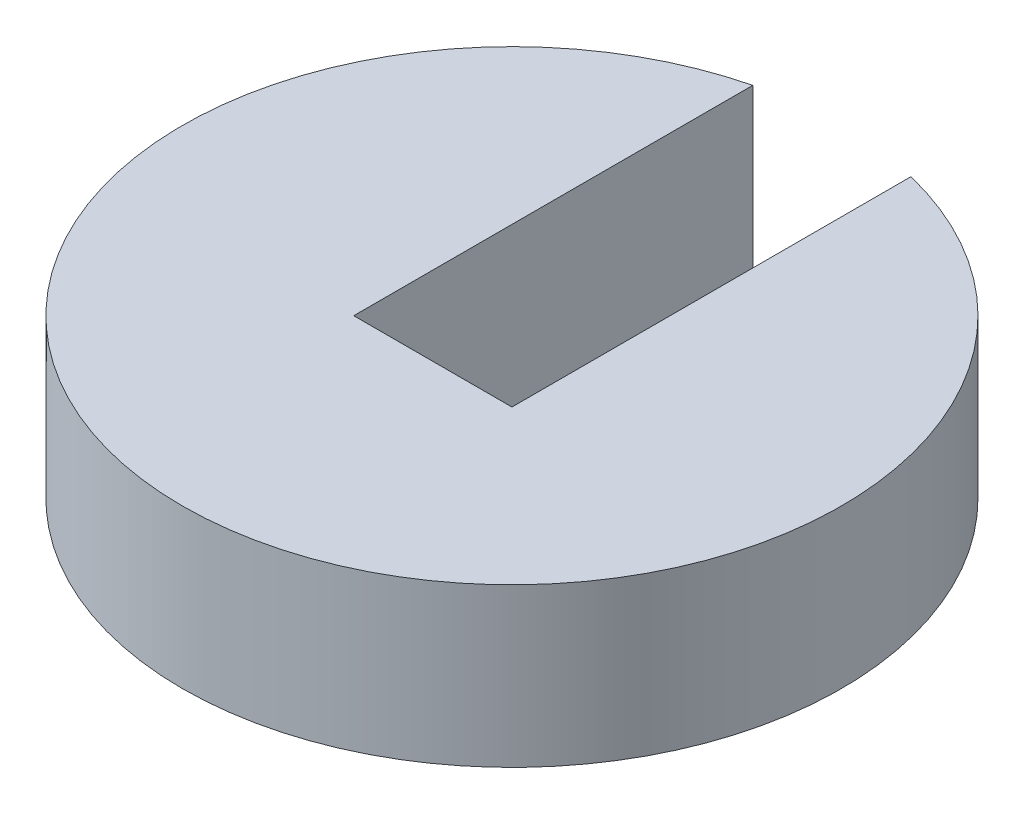
ISO-10303-21;
HEADER;
FILE_DESCRIPTION(('STEP AP214'),'2;1');
FILE_NAME('part.step','',(''),(''),'','','');
FILE_SCHEMA(('AUTOMOTIVE_DESIGN { 1 0 10303 214 1 1 1 1 }'));
ENDSEC;
DATA;
#1=APPLICATION_CONTEXT('core data for automotive mechanical design processes');
#2=APPLICATION_PROTOCOL_DEFINITION('international standard','automotive_design',2000,#1);
#3=PRODUCT_CONTEXT('',#1,'mechanical');
#4=PRODUCT('Part','Part','',(#3));
#5=PRODUCT_RELATED_PRODUCT_CATEGORY('part','',(#4));
#6=PRODUCT_DEFINITION_FORMATION('','',#4);
#7=PRODUCT_DEFINITION_CONTEXT('part definition',#1,'design');
#8=PRODUCT_DEFINITION('design','',#6,#7);
#9=PRODUCT_DEFINITION_SHAPE('','',#8);
#10=(LENGTH_UNIT() NAMED_UNIT(*) SI_UNIT(.MILLI.,.METRE.));
#11=(NAMED_UNIT(*) PLANE_ANGLE_UNIT() SI_UNIT($,.RADIAN.));
#12=(NAMED_UNIT(*) SI_UNIT($,.STERADIAN.) SOLID_ANGLE_UNIT());
#13=UNCERTAINTY_MEASURE_WITH_UNIT(LENGTH_MEASURE(1.E-05),#10,'distance_accuracy_value','');
#14=(GEOMETRIC_REPRESENTATION_CONTEXT(3) GLOBAL_UNCERTAINTY_ASSIGNED_CONTEXT((#13)) GLOBAL_UNIT_ASSIGNED_CONTEXT((#10,
#11,#12)) REPRESENTATION_CONTEXT('',''));
#15=CARTESIAN_POINT('',(0.,0.,0.));
#16=DIRECTION('',(0.,0.,1.));
#17=DIRECTION('',(1.,0.,0.));
#18=AXIS2_PLACEMENT_3D('',#15,#16,#17);
#19=CARTESIAN_POINT('',(0.,6.,0.));
#20=DIRECTION('',(0.,-1.,0.));
#21=DIRECTION('',(0.,0.,-1.));
#22=AXIS2_PLACEMENT_3D('',#19,#20,#21);
#23=CYLINDRICAL_SURFACE('',#22,12.5);
#24=CARTESIAN_POINT('',(0.,0.,0.));
#25=DIRECTION('',(0.,1.,0.));
#26=DIRECTION('',(0.,0.,1.));
#27=AXIS2_PLACEMENT_3D('',#24,#25,#26);
#28=CIRCLE('',#27,12.5);
#29=CARTESIAN_POINT('',(-3.,0.,-12.1346610995116));
#30=VERTEX_POINT('',#29);
#31=CARTESIAN_POINT('',(3.,0.,-12.1346610995116));
#32=VERTEX_POINT('',#31);
#33=EDGE_CURVE('E96',#30,#32,#28,.T.);
#34=ORIENTED_EDGE('',*,*,#33,.T.);
#35=DIRECTION('',(0.,-1.,0.));
#36=VECTOR('',#35,1.);
#37=CARTESIAN_POINT('',(3.,6.,-12.1346610995116));
#38=LINE('',#37,#36);
#39=CARTESIAN_POINT('',(3.,6.,-12.1346610995116));
#40=VERTEX_POINT('',#39);
#41=EDGE_CURVE('E11',#40,#32,#38,.T.);
#42=ORIENTED_EDGE('',*,*,#41,.F.);
#43=CARTESIAN_POINT('',(0.,6.,0.));
#44=DIRECTION('',(0.,1.,0.));
#45=DIRECTION('',(0.,0.,1.));
#46=AXIS2_PLACEMENT_3D('',#43,#44,#45);
#47=CIRCLE('',#46,12.5);
#48=CARTESIAN_POINT('',(-3.,6.,-12.1346610995116));
#49=VERTEX_POINT('',#48);
#50=EDGE_CURVE('E84',#49,#40,#47,.T.);
#51=ORIENTED_EDGE('',*,*,#50,.F.);
#52=DIRECTION('',(0.,-1.,0.));
#53=VECTOR('',#52,1.);
#54=CARTESIAN_POINT('',(-3.,6.,-12.1346610995116));
#55=LINE('',#54,#53);
#56=EDGE_CURVE('E92',#49,#30,#55,.T.);
#57=ORIENTED_EDGE('',*,*,#56,.T.);
#58=EDGE_LOOP('',(#34,#42,#51,#57));
#59=FACE_BOUND('',#58,.T.);
#60=ADVANCED_FACE('F33',(#59),#23,.T.);
#61=CARTESIAN_POINT('',(3.,6.,3.));
#62=DIRECTION('',(1.,0.,0.));
#63=DIRECTION('',(0.,0.,-1.));
#64=AXIS2_PLACEMENT_3D('',#61,#62,#63);
#65=PLANE('',#64);
#66=DIRECTION('',(0.,0.,1.));
#67=VECTOR('',#66,1.);
#68=CARTESIAN_POINT('',(3.,0.,3.));
#69=LINE('',#68,#67);
#70=CARTESIAN_POINT('',(3.,0.,3.));
#71=VERTEX_POINT('',#70);
#72=EDGE_CURVE('E88',#32,#71,#69,.T.);
#73=ORIENTED_EDGE('',*,*,#72,.T.);
#74=DIRECTION('',(0.,-1.,0.));
#75=VECTOR('',#74,1.);
#76=CARTESIAN_POINT('',(3.,6.,3.));
#77=LINE('',#76,#75);
#78=CARTESIAN_POINT('',(3.,6.,3.));
#79=VERTEX_POINT('',#78);
#80=EDGE_CURVE('E41',#79,#71,#77,.T.);
#81=ORIENTED_EDGE('',*,*,#80,.F.);
#82=DIRECTION('',(0.,0.,1.));
#83=VECTOR('',#82,1.);
#84=CARTESIAN_POINT('',(3.,6.,3.));
#85=LINE('',#84,#83);
#86=EDGE_CURVE('E79',#40,#79,#85,.T.);
#87=ORIENTED_EDGE('',*,*,#86,.F.);
#88=ORIENTED_EDGE('',*,*,#41,.T.);
#89=EDGE_LOOP('',(#73,#81,#87,#88));
#90=FACE_BOUND('',#89,.T.);
#91=ADVANCED_FACE('F87',(#90),#65,.F.);
#92=CARTESIAN_POINT('',(-3.,6.,3.));
#93=DIRECTION('',(0.,0.,1.));
#94=DIRECTION('',(1.,0.,0.));
#95=AXIS2_PLACEMENT_3D('',#92,#93,#94);
#96=PLANE('',#95);
#97=DIRECTION('',(-1.,0.,0.));
#98=VECTOR('',#97,1.);
#99=CARTESIAN_POINT('',(-3.,0.,3.));
#100=LINE('',#99,#98);
#101=CARTESIAN_POINT('',(-3.,0.,3.));
#102=VERTEX_POINT('',#101);
#103=EDGE_CURVE('E66',#71,#102,#100,.T.);
#104=ORIENTED_EDGE('',*,*,#103,.T.);
#105=DIRECTION('',(0.,-1.,0.));
#106=VECTOR('',#105,1.);
#107=CARTESIAN_POINT('',(-3.,6.,3.));
#108=LINE('',#107,#106);
#109=CARTESIAN_POINT('',(-3.,6.,3.));
#110=VERTEX_POINT('',#109);
#111=EDGE_CURVE('E89',#110,#102,#108,.T.);
#112=ORIENTED_EDGE('',*,*,#111,.F.);
#113=DIRECTION('',(-1.,0.,0.));
#114=VECTOR('',#113,1.);
#115=CARTESIAN_POINT('',(-3.,6.,3.));
#116=LINE('',#115,#114);
#117=EDGE_CURVE('E82',#79,#110,#116,.T.);
#118=ORIENTED_EDGE('',*,*,#117,.F.);
#119=ORIENTED_EDGE('',*,*,#80,.T.);
#120=EDGE_LOOP('',(#104,#112,#118,#119));
#121=FACE_BOUND('',#120,.T.);
#122=ADVANCED_FACE('F90',(#121),#96,.F.);
#123=CARTESIAN_POINT('',(-3.,6.,-12.1346610995116));
#124=DIRECTION('',(-1.,0.,0.));
#125=DIRECTION('',(0.,0.,1.));
#126=AXIS2_PLACEMENT_3D('',#123,#124,#125);
#127=PLANE('',#126);
#128=DIRECTION('',(0.,0.,-1.));
#129=VECTOR('',#128,1.);
#130=CARTESIAN_POINT('',(-3.,0.,-12.1346610995116));
#131=LINE('',#130,#129);
#132=EDGE_CURVE('E72',#102,#30,#131,.T.);
#133=ORIENTED_EDGE('',*,*,#132,.T.);
#134=ORIENTED_EDGE('',*,*,#56,.F.);
#135=DIRECTION('',(0.,0.,-1.));
#136=VECTOR('',#135,1.);
#137=CARTESIAN_POINT('',(-3.,6.,-12.1346610995116));
#138=LINE('',#137,#136);
#139=EDGE_CURVE('E49',#110,#49,#138,.T.);
#140=ORIENTED_EDGE('',*,*,#139,.F.);
#141=ORIENTED_EDGE('',*,*,#111,.T.);
#142=EDGE_LOOP('',(#133,#134,#140,#141));
#143=FACE_BOUND('',#142,.T.);
#144=ADVANCED_FACE('F103',(#143),#127,.F.);
#145=CARTESIAN_POINT('',(0.,6.,0.));
#146=DIRECTION('',(0.,1.,0.));
#147=DIRECTION('',(0.,0.,1.));
#148=AXIS2_PLACEMENT_3D('',#145,#146,#147);
#149=PLANE('',#148);
#150=ORIENTED_EDGE('',*,*,#50,.T.);
#151=ORIENTED_EDGE('',*,*,#86,.T.);
#152=ORIENTED_EDGE('',*,*,#117,.T.);
#153=ORIENTED_EDGE('',*,*,#139,.T.);
#154=EDGE_LOOP('',(#150,#151,#152,#153));
#155=FACE_BOUND('',#154,.T.);
#156=ADVANCED_FACE('F80',(#155),#149,.T.);
#157=CARTESIAN_POINT('',(0.,0.,0.));
#158=DIRECTION('',(0.,1.,0.));
#159=DIRECTION('',(0.,0.,1.));
#160=AXIS2_PLACEMENT_3D('',#157,#158,#159);
#161=PLANE('',#160);
#162=ORIENTED_EDGE('',*,*,#33,.F.);
#163=ORIENTED_EDGE('',*,*,#132,.F.);
#164=ORIENTED_EDGE('',*,*,#103,.F.);
#165=ORIENTED_EDGE('',*,*,#72,.F.);
#166=EDGE_LOOP('',(#162,#163,#164,#165));
#167=FACE_BOUND('',#166,.T.);
#168=ADVANCED_FACE('F106',(#167),#161,.F.);
#169=CLOSED_SHELL('',(#60,#91,#122,#144,#156,#168));
#170=MANIFOLD_SOLID_BREP('B2',#169);
#171=ADVANCED_BREP_SHAPE_REPRESENTATION('',(#18,#170),#14);
#172=SHAPE_DEFINITION_REPRESENTATION(#9,#171);
ENDSEC;
END-ISO-10303-21;
